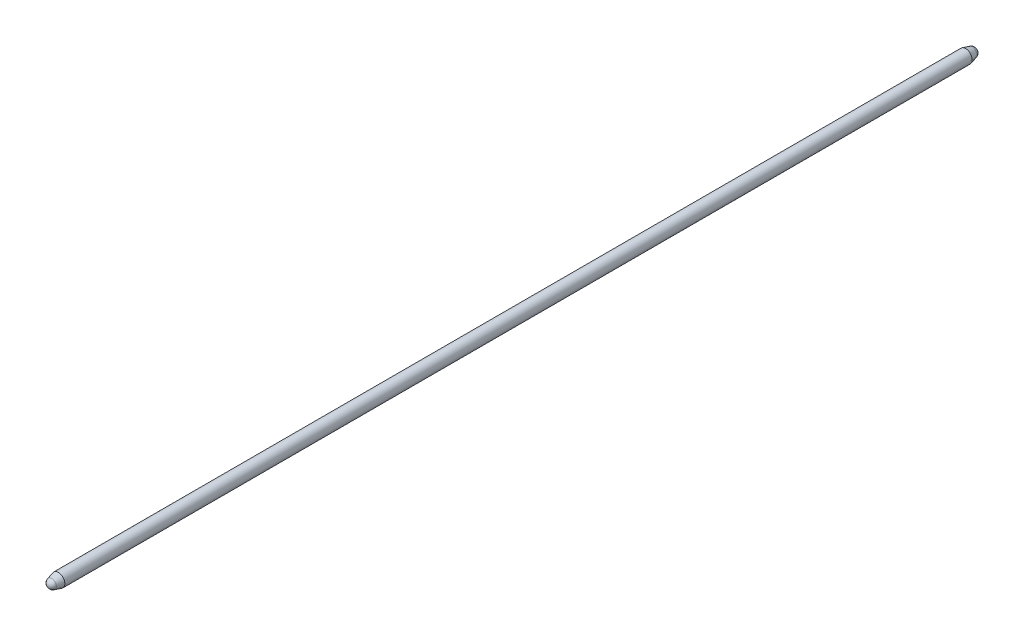
ISO-10303-21;
HEADER;
FILE_DESCRIPTION(('STEP AP214'),'2;1');
FILE_NAME('part.step','',(''),(''),'','','');
FILE_SCHEMA(('AUTOMOTIVE_DESIGN { 1 0 10303 214 1 1 1 1 }'));
ENDSEC;
DATA;
#1=APPLICATION_CONTEXT('core data for automotive mechanical design processes');
#2=APPLICATION_PROTOCOL_DEFINITION('international standard','automotive_design',2000,#1);
#3=PRODUCT_CONTEXT('',#1,'mechanical');
#4=PRODUCT('Part','Part','',(#3));
#5=PRODUCT_RELATED_PRODUCT_CATEGORY('part','',(#4));
#6=PRODUCT_DEFINITION_FORMATION('','',#4);
#7=PRODUCT_DEFINITION_CONTEXT('part definition',#1,'design');
#8=PRODUCT_DEFINITION('design','',#6,#7);
#9=PRODUCT_DEFINITION_SHAPE('','',#8);
#10=(LENGTH_UNIT() NAMED_UNIT(*) SI_UNIT(.MILLI.,.METRE.));
#11=(NAMED_UNIT(*) PLANE_ANGLE_UNIT() SI_UNIT($,.RADIAN.));
#12=(NAMED_UNIT(*) SI_UNIT($,.STERADIAN.) SOLID_ANGLE_UNIT());
#13=UNCERTAINTY_MEASURE_WITH_UNIT(LENGTH_MEASURE(1.E-05),#10,'distance_accuracy_value','');
#14=(GEOMETRIC_REPRESENTATION_CONTEXT(3) GLOBAL_UNCERTAINTY_ASSIGNED_CONTEXT((#13)) GLOBAL_UNIT_ASSIGNED_CONTEXT((#10,
#11,#12)) REPRESENTATION_CONTEXT('',''));
#15=CARTESIAN_POINT('',(0.,0.,0.));
#16=DIRECTION('',(0.,0.,1.));
#17=DIRECTION('',(1.,0.,0.));
#18=AXIS2_PLACEMENT_3D('',#15,#16,#17);
#19=CARTESIAN_POINT('',(0.,0.,-1788.31331908373));
#20=DIRECTION('',(0.,0.,-1.));
#21=DIRECTION('',(0.,1.,0.));
#22=AXIS2_PLACEMENT_3D('',#19,#20,#21);
#23=SPHERICAL_SURFACE('',#22,19.05);
#24=CARTESIAN_POINT('',(0.,0.,-1793.24382189294));
#25=DIRECTION('',(0.,0.,-1.));
#26=DIRECTION('',(0.,1.,0.));
#27=AXIS2_PLACEMENT_3D('',#24,#25,#26);
#28=CIRCLE('',#27,18.4008869908067);
#29=CARTESIAN_POINT('',(0.,18.4008869908068,-1793.24382189294));
#30=VERTEX_POINT('',#29);
#31=EDGE_CURVE('E10',#30,#30,#28,.T.);
#32=ORIENTED_EDGE('',*,*,#31,.T.);
#33=EDGE_LOOP('',(#32));
#34=FACE_BOUND('',#33,.T.);
#35=ADVANCED_FACE('F31',(#34),#23,.T.);
#36=CARTESIAN_POINT('',(0.,0.,-1793.24382189294));
#37=DIRECTION('',(0.,0.,1.));
#38=DIRECTION('',(0.,-1.,0.));
#39=AXIS2_PLACEMENT_3D('',#36,#37,#38);
#40=CONICAL_SURFACE('',#39,18.4008869908067,0.26179938779915);
#41=CARTESIAN_POINT('',(0.,0.,-1767.12277653471));
#42=DIRECTION('',(0.,0.,-1.));
#43=DIRECTION('',(0.,1.,0.));
#44=AXIS2_PLACEMENT_3D('',#41,#42,#43);
#45=CIRCLE('',#44,25.4);
#46=CARTESIAN_POINT('',(0.,25.4,-1767.12277653471));
#47=VERTEX_POINT('',#46);
#48=EDGE_CURVE('E38',#47,#47,#45,.T.);
#49=ORIENTED_EDGE('',*,*,#48,.T.);
#50=EDGE_LOOP('',(#49));
#51=FACE_BOUND('',#50,.T.);
#52=ORIENTED_EDGE('',*,*,#31,.F.);
#53=EDGE_LOOP('',(#52));
#54=FACE_BOUND('',#53,.T.);
#55=ADVANCED_FACE('F86',(#51,#54),#40,.T.);
#56=CARTESIAN_POINT('',(0.,0.,-1807.36331908373));
#57=DIRECTION('',(0.,0.,-1.));
#58=DIRECTION('',(0.,1.,0.));
#59=AXIS2_PLACEMENT_3D('',#56,#57,#58);
#60=CYLINDRICAL_SURFACE('',#59,25.4);
#61=CARTESIAN_POINT('',(0.,0.,1767.12277653471));
#62=DIRECTION('',(0.,0.,-1.));
#63=DIRECTION('',(0.,1.,0.));
#64=AXIS2_PLACEMENT_3D('',#61,#62,#63);
#65=CIRCLE('',#64,25.4);
#66=CARTESIAN_POINT('',(0.,25.4,1767.12277653471));
#67=VERTEX_POINT('',#66);
#68=EDGE_CURVE('E42',#67,#67,#65,.T.);
#69=ORIENTED_EDGE('',*,*,#68,.T.);
#70=EDGE_LOOP('',(#69));
#71=FACE_BOUND('',#70,.T.);
#72=ORIENTED_EDGE('',*,*,#48,.F.);
#73=EDGE_LOOP('',(#72));
#74=FACE_BOUND('',#73,.T.);
#75=ADVANCED_FACE('F83',(#71,#74),#60,.T.);
#76=CARTESIAN_POINT('',(0.,0.,1767.12277653471));
#77=DIRECTION('',(0.,0.,-1.));
#78=DIRECTION('',(0.,1.,0.));
#79=AXIS2_PLACEMENT_3D('',#76,#77,#78);
#80=CONICAL_SURFACE('',#79,25.4,0.26179938779915);
#81=CARTESIAN_POINT('',(0.,0.,1793.24382189294));
#82=DIRECTION('',(0.,0.,-1.));
#83=DIRECTION('',(0.,1.,0.));
#84=AXIS2_PLACEMENT_3D('',#81,#82,#83);
#85=CIRCLE('',#84,18.4008869908068);
#86=CARTESIAN_POINT('',(0.,18.4008869908068,1793.24382189294));
#87=VERTEX_POINT('',#86);
#88=EDGE_CURVE('E46',#87,#87,#85,.T.);
#89=ORIENTED_EDGE('',*,*,#88,.T.);
#90=EDGE_LOOP('',(#89));
#91=FACE_BOUND('',#90,.T.);
#92=ORIENTED_EDGE('',*,*,#68,.F.);
#93=EDGE_LOOP('',(#92));
#94=FACE_BOUND('',#93,.T.);
#95=ADVANCED_FACE('F79',(#91,#94),#80,.T.);
#96=CARTESIAN_POINT('',(0.,0.,1788.31331908373));
#97=DIRECTION('',(0.,0.,-1.));
#98=DIRECTION('',(0.,1.,0.));
#99=AXIS2_PLACEMENT_3D('',#96,#97,#98);
#100=SPHERICAL_SURFACE('',#99,19.05);
#101=ORIENTED_EDGE('',*,*,#88,.F.);
#102=EDGE_LOOP('',(#101));
#103=FACE_BOUND('',#102,.T.);
#104=ADVANCED_FACE('F77',(#103),#100,.T.);
#105=CLOSED_SHELL('',(#35,#55,#75,#95,#104));
#106=CARTESIAN_POINT('',(0.,0.,1767.12277653471));
#107=DIRECTION('',(0.,0.,-1.));
#108=DIRECTION('',(0.,1.,0.));
#109=AXIS2_PLACEMENT_3D('',#106,#107,#108);
#110=PLANE('',#109);
#111=CARTESIAN_POINT('',(0.,0.,1767.12277653471));
#112=DIRECTION('',(0.,0.,-1.));
#113=DIRECTION('',(0.,1.,0.));
#114=AXIS2_PLACEMENT_3D('',#111,#112,#113);
#115=CIRCLE('',#114,22.987);
#116=CARTESIAN_POINT('',(0.,22.987,1767.12277653471));
#117=VERTEX_POINT('',#116);
#118=EDGE_CURVE('E51',#117,#117,#115,.T.);
#119=ORIENTED_EDGE('',*,*,#118,.T.);
#120=EDGE_LOOP('',(#119));
#121=FACE_BOUND('',#120,.T.);
#122=ADVANCED_FACE('F68',(#121),#110,.T.);
#123=CARTESIAN_POINT('',(0.,0.,-1807.36331908373));
#124=DIRECTION('',(0.,0.,-1.));
#125=DIRECTION('',(0.,1.,0.));
#126=AXIS2_PLACEMENT_3D('',#123,#124,#125);
#127=CYLINDRICAL_SURFACE('',#126,22.987);
#128=CARTESIAN_POINT('',(0.,0.,-1767.12277653471));
#129=DIRECTION('',(0.,0.,-1.));
#130=DIRECTION('',(0.,1.,0.));
#131=AXIS2_PLACEMENT_3D('',#128,#129,#130);
#132=CIRCLE('',#131,22.987);
#133=CARTESIAN_POINT('',(0.,22.987,-1767.12277653471));
#134=VERTEX_POINT('',#133);
#135=EDGE_CURVE('E54',#134,#134,#132,.T.);
#136=ORIENTED_EDGE('',*,*,#135,.T.);
#137=EDGE_LOOP('',(#136));
#138=FACE_BOUND('',#137,.T.);
#139=ORIENTED_EDGE('',*,*,#118,.F.);
#140=EDGE_LOOP('',(#139));
#141=FACE_BOUND('',#140,.T.);
#142=ADVANCED_FACE('F58',(#138,#141),#127,.F.);
#143=CARTESIAN_POINT('',(0.,0.,-1767.12277653471));
#144=DIRECTION('',(0.,0.,1.));
#145=DIRECTION('',(0.,-1.,0.));
#146=AXIS2_PLACEMENT_3D('',#143,#144,#145);
#147=PLANE('',#146);
#148=ORIENTED_EDGE('',*,*,#135,.F.);
#149=EDGE_LOOP('',(#148));
#150=FACE_BOUND('',#149,.T.);
#151=ADVANCED_FACE('F61',(#150),#147,.T.);
#152=CLOSED_SHELL('',(#122,#142,#151));
#153=ORIENTED_CLOSED_SHELL('',*,#152,.T.);
#154=BREP_WITH_VOIDS('B2',#105,(#153));
#155=ADVANCED_BREP_SHAPE_REPRESENTATION('',(#18,#154),#14);
#156=SHAPE_DEFINITION_REPRESENTATION(#9,#155);
ENDSEC;
END-ISO-10303-21;
